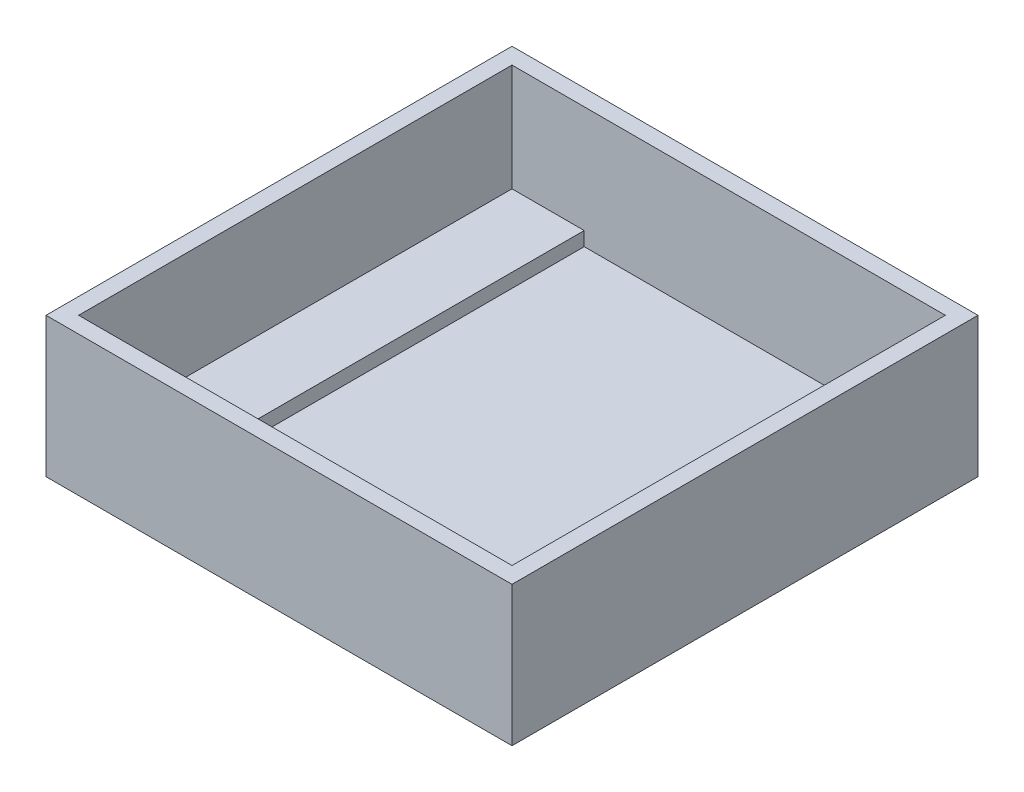
ISO-10303-21;
HEADER;
FILE_DESCRIPTION(('STEP AP214'),'2;1');
FILE_NAME('part.step','',(''),(''),'','','');
FILE_SCHEMA(('AUTOMOTIVE_DESIGN { 1 0 10303 214 1 1 1 1 }'));
ENDSEC;
DATA;
#1=APPLICATION_CONTEXT('core data for automotive mechanical design processes');
#2=APPLICATION_PROTOCOL_DEFINITION('international standard','automotive_design',2000,#1);
#3=PRODUCT_CONTEXT('',#1,'mechanical');
#4=PRODUCT('Part','Part','',(#3));
#5=PRODUCT_RELATED_PRODUCT_CATEGORY('part','',(#4));
#6=PRODUCT_DEFINITION_FORMATION('','',#4);
#7=PRODUCT_DEFINITION_CONTEXT('part definition',#1,'design');
#8=PRODUCT_DEFINITION('design','',#6,#7);
#9=PRODUCT_DEFINITION_SHAPE('','',#8);
#10=(LENGTH_UNIT() NAMED_UNIT(*) SI_UNIT(.MILLI.,.METRE.));
#11=(NAMED_UNIT(*) PLANE_ANGLE_UNIT() SI_UNIT($,.RADIAN.));
#12=(NAMED_UNIT(*) SI_UNIT($,.STERADIAN.) SOLID_ANGLE_UNIT());
#13=UNCERTAINTY_MEASURE_WITH_UNIT(LENGTH_MEASURE(1.E-05),#10,'distance_accuracy_value','');
#14=(GEOMETRIC_REPRESENTATION_CONTEXT(3) GLOBAL_UNCERTAINTY_ASSIGNED_CONTEXT((#13)) GLOBAL_UNIT_ASSIGNED_CONTEXT((#10,
#11,#12)) REPRESENTATION_CONTEXT('',''));
#15=CARTESIAN_POINT('',(0.,0.,0.));
#16=DIRECTION('',(0.,0.,1.));
#17=DIRECTION('',(1.,0.,0.));
#18=AXIS2_PLACEMENT_3D('',#15,#16,#17);
#19=CARTESIAN_POINT('',(1.33226762955019E-12,300.,-465.000000000001));
#20=DIRECTION('',(0.,0.,1.));
#21=DIRECTION('',(1.,0.,0.));
#22=AXIS2_PLACEMENT_3D('',#19,#20,#21);
#23=PLANE('',#22);
#24=DIRECTION('',(1.,0.,0.));
#25=VECTOR('',#24,1.);
#26=CARTESIAN_POINT('',(0.,40.,-465.));
#27=LINE('',#26,#25);
#28=CARTESIAN_POINT('',(-310.,40.,-465.));
#29=VERTEX_POINT('',#28);
#30=CARTESIAN_POINT('',(310.,40.,-465.));
#31=VERTEX_POINT('',#30);
#32=EDGE_CURVE('E147',#29,#31,#27,.T.);
#33=ORIENTED_EDGE('',*,*,#32,.T.);
#34=DIRECTION('',(0.,-1.,0.));
#35=VECTOR('',#34,1.);
#36=CARTESIAN_POINT('',(310.,70.,-465.));
#37=LINE('',#36,#35);
#38=CARTESIAN_POINT('',(310.,70.,-465.));
#39=VERTEX_POINT('',#38);
#40=EDGE_CURVE('E133',#39,#31,#37,.T.);
#41=ORIENTED_EDGE('',*,*,#40,.F.);
#42=DIRECTION('',(-1.,0.,0.));
#43=VECTOR('',#42,1.);
#44=CARTESIAN_POINT('',(1.33226762955019E-12,70.,-465.000000000001));
#45=LINE('',#44,#43);
#46=CARTESIAN_POINT('',(464.999999999999,70.,-465.));
#47=VERTEX_POINT('',#46);
#48=EDGE_CURVE('E164',#47,#39,#45,.T.);
#49=ORIENTED_EDGE('',*,*,#48,.F.);
#50=DIRECTION('',(0.,-1.,0.));
#51=VECTOR('',#50,1.);
#52=CARTESIAN_POINT('',(464.999999999999,300.,-465.));
#53=LINE('',#52,#51);
#54=CARTESIAN_POINT('',(464.999999999999,300.,-465.));
#55=VERTEX_POINT('',#54);
#56=EDGE_CURVE('E42',#55,#47,#53,.T.);
#57=ORIENTED_EDGE('',*,*,#56,.F.);
#58=DIRECTION('',(-1.,0.,0.));
#59=VECTOR('',#58,1.);
#60=CARTESIAN_POINT('',(1.33226762955019E-12,300.,-465.000000000001));
#61=LINE('',#60,#59);
#62=CARTESIAN_POINT('',(-465.,300.,-465.));
#63=VERTEX_POINT('',#62);
#64=EDGE_CURVE('E191',#55,#63,#61,.T.);
#65=ORIENTED_EDGE('',*,*,#64,.T.);
#66=DIRECTION('',(0.,-1.,0.));
#67=VECTOR('',#66,1.);
#68=CARTESIAN_POINT('',(-465.,300.,-465.));
#69=LINE('',#68,#67);
#70=CARTESIAN_POINT('',(-465.,70.,-465.));
#71=VERTEX_POINT('',#70);
#72=EDGE_CURVE('E223',#63,#71,#69,.T.);
#73=ORIENTED_EDGE('',*,*,#72,.T.);
#74=DIRECTION('',(-1.,0.,0.));
#75=VECTOR('',#74,1.);
#76=CARTESIAN_POINT('',(0.,70.,-465.));
#77=LINE('',#76,#75);
#78=CARTESIAN_POINT('',(-310.,70.,-465.));
#79=VERTEX_POINT('',#78);
#80=EDGE_CURVE('E182',#79,#71,#77,.T.);
#81=ORIENTED_EDGE('',*,*,#80,.F.);
#82=DIRECTION('',(0.,-1.,0.));
#83=VECTOR('',#82,1.);
#84=CARTESIAN_POINT('',(-310.,70.,-465.));
#85=LINE('',#84,#83);
#86=EDGE_CURVE('E149',#79,#29,#85,.T.);
#87=ORIENTED_EDGE('',*,*,#86,.T.);
#88=EDGE_LOOP('',(#33,#41,#49,#57,#65,#73,#81,#87));
#89=FACE_BOUND('',#88,.T.);
#90=ADVANCED_FACE('F39',(#89),#23,.T.);
#91=CARTESIAN_POINT('',(4.99600361081322E-13,300.,465.));
#92=DIRECTION('',(0.,0.,-1.));
#93=DIRECTION('',(-1.,0.,0.));
#94=AXIS2_PLACEMENT_3D('',#91,#92,#93);
#95=PLANE('',#94);
#96=DIRECTION('',(1.,0.,0.));
#97=VECTOR('',#96,1.);
#98=CARTESIAN_POINT('',(0.,40.,465.));
#99=LINE('',#98,#97);
#100=CARTESIAN_POINT('',(-310.,40.,465.));
#101=VERTEX_POINT('',#100);
#102=CARTESIAN_POINT('',(310.,40.,465.));
#103=VERTEX_POINT('',#102);
#104=EDGE_CURVE('E56',#101,#103,#99,.T.);
#105=ORIENTED_EDGE('',*,*,#104,.F.);
#106=DIRECTION('',(0.,-1.,0.));
#107=VECTOR('',#106,1.);
#108=CARTESIAN_POINT('',(-310.,70.,465.));
#109=LINE('',#108,#107);
#110=CARTESIAN_POINT('',(-310.,70.,465.));
#111=VERTEX_POINT('',#110);
#112=EDGE_CURVE('E187',#111,#101,#109,.T.);
#113=ORIENTED_EDGE('',*,*,#112,.F.);
#114=DIRECTION('',(1.,0.,0.));
#115=VECTOR('',#114,1.);
#116=CARTESIAN_POINT('',(1.66533453693773E-12,70.,464.999999999999));
#117=LINE('',#116,#115);
#118=CARTESIAN_POINT('',(-465.,70.,465.000000000001));
#119=VERTEX_POINT('',#118);
#120=EDGE_CURVE('E176',#119,#111,#117,.T.);
#121=ORIENTED_EDGE('',*,*,#120,.F.);
#122=DIRECTION('',(0.,-1.,0.));
#123=VECTOR('',#122,1.);
#124=CARTESIAN_POINT('',(-465.,300.,465.000000000001));
#125=LINE('',#124,#123);
#126=CARTESIAN_POINT('',(-465.,300.,465.000000000001));
#127=VERTEX_POINT('',#126);
#128=EDGE_CURVE('E249',#127,#119,#125,.T.);
#129=ORIENTED_EDGE('',*,*,#128,.F.);
#130=DIRECTION('',(1.,0.,0.));
#131=VECTOR('',#130,1.);
#132=CARTESIAN_POINT('',(4.99600361081322E-13,300.,465.));
#133=LINE('',#132,#131);
#134=CARTESIAN_POINT('',(465.,300.,465.));
#135=VERTEX_POINT('',#134);
#136=EDGE_CURVE('E200',#127,#135,#133,.T.);
#137=ORIENTED_EDGE('',*,*,#136,.T.);
#138=DIRECTION('',(0.,-1.,0.));
#139=VECTOR('',#138,1.);
#140=CARTESIAN_POINT('',(465.,300.,465.));
#141=LINE('',#140,#139);
#142=CARTESIAN_POINT('',(465.,70.,465.));
#143=VERTEX_POINT('',#142);
#144=EDGE_CURVE('E252',#135,#143,#141,.T.);
#145=ORIENTED_EDGE('',*,*,#144,.T.);
#146=DIRECTION('',(1.,0.,0.));
#147=VECTOR('',#146,1.);
#148=CARTESIAN_POINT('',(4.99600361081322E-13,70.,465.));
#149=LINE('',#148,#147);
#150=CARTESIAN_POINT('',(310.,70.,465.));
#151=VERTEX_POINT('',#150);
#152=EDGE_CURVE('E169',#151,#143,#149,.T.);
#153=ORIENTED_EDGE('',*,*,#152,.F.);
#154=DIRECTION('',(0.,-1.,0.));
#155=VECTOR('',#154,1.);
#156=CARTESIAN_POINT('',(310.,70.,465.));
#157=LINE('',#156,#155);
#158=EDGE_CURVE('E144',#151,#103,#157,.T.);
#159=ORIENTED_EDGE('',*,*,#158,.T.);
#160=EDGE_LOOP('',(#105,#113,#121,#129,#137,#145,#153,#159));
#161=FACE_BOUND('',#160,.T.);
#162=ADVANCED_FACE('F288',(#161),#95,.T.);
#163=CARTESIAN_POINT('',(0.,300.,500.));
#164=DIRECTION('',(0.,0.,-1.));
#165=DIRECTION('',(-1.,0.,0.));
#166=AXIS2_PLACEMENT_3D('',#163,#164,#165);
#167=PLANE('',#166);
#168=DIRECTION('',(1.,0.,0.));
#169=VECTOR('',#168,1.);
#170=CARTESIAN_POINT('',(0.,0.,500.));
#171=LINE('',#170,#169);
#172=CARTESIAN_POINT('',(-500.,0.,500.));
#173=VERTEX_POINT('',#172);
#174=CARTESIAN_POINT('',(500.,0.,500.));
#175=VERTEX_POINT('',#174);
#176=EDGE_CURVE('E190',#173,#175,#171,.T.);
#177=ORIENTED_EDGE('',*,*,#176,.T.);
#178=DIRECTION('',(0.,-1.,0.));
#179=VECTOR('',#178,1.);
#180=CARTESIAN_POINT('',(500.,300.,500.));
#181=LINE('',#180,#179);
#182=CARTESIAN_POINT('',(500.,300.,500.));
#183=VERTEX_POINT('',#182);
#184=EDGE_CURVE('E11',#183,#175,#181,.T.);
#185=ORIENTED_EDGE('',*,*,#184,.F.);
#186=DIRECTION('',(1.,0.,0.));
#187=VECTOR('',#186,1.);
#188=CARTESIAN_POINT('',(0.,300.,500.));
#189=LINE('',#188,#187);
#190=CARTESIAN_POINT('',(-500.,300.,500.));
#191=VERTEX_POINT('',#190);
#192=EDGE_CURVE('E208',#191,#183,#189,.T.);
#193=ORIENTED_EDGE('',*,*,#192,.F.);
#194=DIRECTION('',(0.,-1.,0.));
#195=VECTOR('',#194,1.);
#196=CARTESIAN_POINT('',(-500.,300.,500.));
#197=LINE('',#196,#195);
#198=EDGE_CURVE('E238',#191,#173,#197,.T.);
#199=ORIENTED_EDGE('',*,*,#198,.T.);
#200=EDGE_LOOP('',(#177,#185,#193,#199));
#201=FACE_BOUND('',#200,.T.);
#202=ADVANCED_FACE('F292',(#201),#167,.F.);
#203=CARTESIAN_POINT('',(500.,300.,0.));
#204=DIRECTION('',(-1.,0.,0.));
#205=DIRECTION('',(0.,0.,1.));
#206=AXIS2_PLACEMENT_3D('',#203,#204,#205);
#207=PLANE('',#206);
#208=DIRECTION('',(0.,0.,-1.));
#209=VECTOR('',#208,1.);
#210=CARTESIAN_POINT('',(500.,0.,0.));
#211=LINE('',#210,#209);
#212=CARTESIAN_POINT('',(500.,0.,-500.));
#213=VERTEX_POINT('',#212);
#214=EDGE_CURVE('E227',#175,#213,#211,.T.);
#215=ORIENTED_EDGE('',*,*,#214,.T.);
#216=DIRECTION('',(0.,-1.,0.));
#217=VECTOR('',#216,1.);
#218=CARTESIAN_POINT('',(500.,300.,-500.));
#219=LINE('',#218,#217);
#220=CARTESIAN_POINT('',(500.,300.,-500.));
#221=VERTEX_POINT('',#220);
#222=EDGE_CURVE('E48',#221,#213,#219,.T.);
#223=ORIENTED_EDGE('',*,*,#222,.F.);
#224=DIRECTION('',(0.,0.,-1.));
#225=VECTOR('',#224,1.);
#226=CARTESIAN_POINT('',(500.,300.,0.));
#227=LINE('',#226,#225);
#228=EDGE_CURVE('E212',#183,#221,#227,.T.);
#229=ORIENTED_EDGE('',*,*,#228,.F.);
#230=ORIENTED_EDGE('',*,*,#184,.T.);
#231=EDGE_LOOP('',(#215,#223,#229,#230));
#232=FACE_BOUND('',#231,.T.);
#233=ADVANCED_FACE('F297',(#232),#207,.F.);
#234=CARTESIAN_POINT('',(0.,300.,-500.));
#235=DIRECTION('',(0.,0.,-1.));
#236=DIRECTION('',(-1.,0.,0.));
#237=AXIS2_PLACEMENT_3D('',#234,#235,#236);
#238=PLANE('',#237);
#239=DIRECTION('',(1.,0.,0.));
#240=VECTOR('',#239,1.);
#241=CARTESIAN_POINT('',(0.,0.,-500.));
#242=LINE('',#241,#240);
#243=CARTESIAN_POINT('',(-500.,0.,-500.));
#244=VERTEX_POINT('',#243);
#245=EDGE_CURVE('E231',#244,#213,#242,.T.);
#246=ORIENTED_EDGE('',*,*,#245,.F.);
#247=DIRECTION('',(0.,-1.,0.));
#248=VECTOR('',#247,1.);
#249=CARTESIAN_POINT('',(-500.,300.,-500.));
#250=LINE('',#249,#248);
#251=CARTESIAN_POINT('',(-500.,300.,-500.));
#252=VERTEX_POINT('',#251);
#253=EDGE_CURVE('E241',#252,#244,#250,.T.);
#254=ORIENTED_EDGE('',*,*,#253,.F.);
#255=DIRECTION('',(1.,0.,0.));
#256=VECTOR('',#255,1.);
#257=CARTESIAN_POINT('',(0.,300.,-500.));
#258=LINE('',#257,#256);
#259=EDGE_CURVE('E215',#252,#221,#258,.T.);
#260=ORIENTED_EDGE('',*,*,#259,.T.);
#261=ORIENTED_EDGE('',*,*,#222,.T.);
#262=EDGE_LOOP('',(#246,#254,#260,#261));
#263=FACE_BOUND('',#262,.T.);
#264=ADVANCED_FACE('F302',(#263),#238,.T.);
#265=CARTESIAN_POINT('',(464.999999999999,300.,0.));
#266=DIRECTION('',(-1.,0.,0.));
#267=DIRECTION('',(0.,0.,1.));
#268=AXIS2_PLACEMENT_3D('',#265,#266,#267);
#269=PLANE('',#268);
#270=DIRECTION('',(0.,0.,-1.));
#271=VECTOR('',#270,1.);
#272=CARTESIAN_POINT('',(464.999999999999,70.,0.));
#273=LINE('',#272,#271);
#274=EDGE_CURVE('E161',#143,#47,#273,.T.);
#275=ORIENTED_EDGE('',*,*,#274,.F.);
#276=ORIENTED_EDGE('',*,*,#144,.F.);
#277=DIRECTION('',(0.,0.,-1.));
#278=VECTOR('',#277,1.);
#279=CARTESIAN_POINT('',(464.999999999999,300.,0.));
#280=LINE('',#279,#278);
#281=EDGE_CURVE('E195',#135,#55,#280,.T.);
#282=ORIENTED_EDGE('',*,*,#281,.T.);
#283=ORIENTED_EDGE('',*,*,#56,.T.);
#284=EDGE_LOOP('',(#275,#276,#282,#283));
#285=FACE_BOUND('',#284,.T.);
#286=ADVANCED_FACE('F260',(#285),#269,.T.);
#287=CARTESIAN_POINT('',(-465.,300.,0.));
#288=DIRECTION('',(1.,0.,0.));
#289=DIRECTION('',(0.,0.,-1.));
#290=AXIS2_PLACEMENT_3D('',#287,#288,#289);
#291=PLANE('',#290);
#292=DIRECTION('',(0.,0.,1.));
#293=VECTOR('',#292,1.);
#294=CARTESIAN_POINT('',(-465.,70.,0.));
#295=LINE('',#294,#293);
#296=EDGE_CURVE('E143',#71,#119,#295,.T.);
#297=ORIENTED_EDGE('',*,*,#296,.F.);
#298=ORIENTED_EDGE('',*,*,#72,.F.);
#299=DIRECTION('',(0.,0.,1.));
#300=VECTOR('',#299,1.);
#301=CARTESIAN_POINT('',(-465.,300.,0.));
#302=LINE('',#301,#300);
#303=EDGE_CURVE('E204',#63,#127,#302,.T.);
#304=ORIENTED_EDGE('',*,*,#303,.T.);
#305=ORIENTED_EDGE('',*,*,#128,.T.);
#306=EDGE_LOOP('',(#297,#298,#304,#305));
#307=FACE_BOUND('',#306,.T.);
#308=ADVANCED_FACE('F270',(#307),#291,.T.);
#309=CARTESIAN_POINT('',(-500.,300.,0.));
#310=DIRECTION('',(-1.,0.,0.));
#311=DIRECTION('',(0.,0.,1.));
#312=AXIS2_PLACEMENT_3D('',#309,#310,#311);
#313=PLANE('',#312);
#314=DIRECTION('',(0.,0.,-1.));
#315=VECTOR('',#314,1.);
#316=CARTESIAN_POINT('',(-500.,0.,0.));
#317=LINE('',#316,#315);
#318=EDGE_CURVE('E196',#173,#244,#317,.T.);
#319=ORIENTED_EDGE('',*,*,#318,.F.);
#320=ORIENTED_EDGE('',*,*,#198,.F.);
#321=DIRECTION('',(0.,0.,-1.));
#322=VECTOR('',#321,1.);
#323=CARTESIAN_POINT('',(-500.,300.,0.));
#324=LINE('',#323,#322);
#325=EDGE_CURVE('E219',#191,#252,#324,.T.);
#326=ORIENTED_EDGE('',*,*,#325,.T.);
#327=ORIENTED_EDGE('',*,*,#253,.T.);
#328=EDGE_LOOP('',(#319,#320,#326,#327));
#329=FACE_BOUND('',#328,.T.);
#330=ADVANCED_FACE('F307',(#329),#313,.T.);
#331=CARTESIAN_POINT('',(0.,300.,0.));
#332=DIRECTION('',(0.,1.,0.));
#333=DIRECTION('',(0.,0.,1.));
#334=AXIS2_PLACEMENT_3D('',#331,#332,#333);
#335=PLANE('',#334);
#336=ORIENTED_EDGE('',*,*,#64,.F.);
#337=ORIENTED_EDGE('',*,*,#281,.F.);
#338=ORIENTED_EDGE('',*,*,#136,.F.);
#339=ORIENTED_EDGE('',*,*,#303,.F.);
#340=EDGE_LOOP('',(#336,#337,#338,#339));
#341=FACE_BOUND('',#340,.T.);
#342=ORIENTED_EDGE('',*,*,#192,.T.);
#343=ORIENTED_EDGE('',*,*,#228,.T.);
#344=ORIENTED_EDGE('',*,*,#259,.F.);
#345=ORIENTED_EDGE('',*,*,#325,.F.);
#346=EDGE_LOOP('',(#342,#343,#344,#345));
#347=FACE_BOUND('',#346,.T.);
#348=ADVANCED_FACE('F265',(#341,#347),#335,.T.);
#349=CARTESIAN_POINT('',(0.,0.,0.));
#350=DIRECTION('',(0.,1.,0.));
#351=DIRECTION('',(0.,0.,1.));
#352=AXIS2_PLACEMENT_3D('',#349,#350,#351);
#353=PLANE('',#352);
#354=ORIENTED_EDGE('',*,*,#176,.F.);
#355=ORIENTED_EDGE('',*,*,#318,.T.);
#356=ORIENTED_EDGE('',*,*,#245,.T.);
#357=ORIENTED_EDGE('',*,*,#214,.F.);
#358=EDGE_LOOP('',(#354,#355,#356,#357));
#359=FACE_BOUND('',#358,.T.);
#360=ADVANCED_FACE('F277',(#359),#353,.F.);
#361=CARTESIAN_POINT('',(-310.,70.,0.));
#362=DIRECTION('',(-1.,0.,0.));
#363=DIRECTION('',(0.,0.,1.));
#364=AXIS2_PLACEMENT_3D('',#361,#362,#363);
#365=PLANE('',#364);
#366=ORIENTED_EDGE('',*,*,#112,.T.);
#367=DIRECTION('',(0.,0.,-1.));
#368=VECTOR('',#367,1.);
#369=CARTESIAN_POINT('',(-310.,40.,0.));
#370=LINE('',#369,#368);
#371=EDGE_CURVE('E63',#101,#29,#370,.T.);
#372=ORIENTED_EDGE('',*,*,#371,.T.);
#373=ORIENTED_EDGE('',*,*,#86,.F.);
#374=DIRECTION('',(0.,0.,-1.));
#375=VECTOR('',#374,1.);
#376=CARTESIAN_POINT('',(-310.,70.,0.));
#377=LINE('',#376,#375);
#378=EDGE_CURVE('E179',#111,#79,#377,.T.);
#379=ORIENTED_EDGE('',*,*,#378,.F.);
#380=EDGE_LOOP('',(#366,#372,#373,#379));
#381=FACE_BOUND('',#380,.T.);
#382=ADVANCED_FACE('F275',(#381),#365,.F.);
#383=CARTESIAN_POINT('',(0.,70.,0.));
#384=DIRECTION('',(0.,1.,0.));
#385=DIRECTION('',(0.,0.,1.));
#386=AXIS2_PLACEMENT_3D('',#383,#384,#385);
#387=PLANE('',#386);
#388=ORIENTED_EDGE('',*,*,#296,.T.);
#389=ORIENTED_EDGE('',*,*,#120,.T.);
#390=ORIENTED_EDGE('',*,*,#378,.T.);
#391=ORIENTED_EDGE('',*,*,#80,.T.);
#392=EDGE_LOOP('',(#388,#389,#390,#391));
#393=FACE_BOUND('',#392,.T.);
#394=ADVANCED_FACE('F272',(#393),#387,.T.);
#395=CARTESIAN_POINT('',(310.,70.,0.));
#396=DIRECTION('',(-1.,0.,0.));
#397=DIRECTION('',(0.,0.,1.));
#398=AXIS2_PLACEMENT_3D('',#395,#396,#397);
#399=PLANE('',#398);
#400=DIRECTION('',(0.,0.,-1.));
#401=VECTOR('',#400,1.);
#402=CARTESIAN_POINT('',(310.,40.,0.));
#403=LINE('',#402,#401);
#404=EDGE_CURVE('E137',#103,#31,#403,.T.);
#405=ORIENTED_EDGE('',*,*,#404,.F.);
#406=ORIENTED_EDGE('',*,*,#158,.F.);
#407=DIRECTION('',(0.,0.,-1.));
#408=VECTOR('',#407,1.);
#409=CARTESIAN_POINT('',(310.,70.,0.));
#410=LINE('',#409,#408);
#411=EDGE_CURVE('E139',#151,#39,#410,.T.);
#412=ORIENTED_EDGE('',*,*,#411,.T.);
#413=ORIENTED_EDGE('',*,*,#40,.T.);
#414=EDGE_LOOP('',(#405,#406,#412,#413));
#415=FACE_BOUND('',#414,.T.);
#416=ADVANCED_FACE('F135',(#415),#399,.T.);
#417=CARTESIAN_POINT('',(0.,70.,0.));
#418=DIRECTION('',(0.,1.,0.));
#419=DIRECTION('',(0.,0.,1.));
#420=AXIS2_PLACEMENT_3D('',#417,#418,#419);
#421=PLANE('',#420);
#422=ORIENTED_EDGE('',*,*,#274,.T.);
#423=ORIENTED_EDGE('',*,*,#48,.T.);
#424=ORIENTED_EDGE('',*,*,#411,.F.);
#425=ORIENTED_EDGE('',*,*,#152,.T.);
#426=EDGE_LOOP('',(#422,#423,#424,#425));
#427=FACE_BOUND('',#426,.T.);
#428=ADVANCED_FACE('F347',(#427),#421,.T.);
#429=CARTESIAN_POINT('',(0.,40.,0.));
#430=DIRECTION('',(0.,1.,0.));
#431=DIRECTION('',(0.,0.,1.));
#432=AXIS2_PLACEMENT_3D('',#429,#430,#431);
#433=PLANE('',#432);
#434=ORIENTED_EDGE('',*,*,#104,.T.);
#435=ORIENTED_EDGE('',*,*,#404,.T.);
#436=ORIENTED_EDGE('',*,*,#32,.F.);
#437=ORIENTED_EDGE('',*,*,#371,.F.);
#438=EDGE_LOOP('',(#434,#435,#436,#437));
#439=FACE_BOUND('',#438,.T.);
#440=ADVANCED_FACE('F153',(#439),#433,.T.);
#441=CLOSED_SHELL('',(#90,#162,#202,#233,#264,#286,#308,#330,#348,#360,#382,#394,#416,#428,#440));
#442=MANIFOLD_SOLID_BREP('B2',#441);
#443=ADVANCED_BREP_SHAPE_REPRESENTATION('',(#18,#442),#14);
#444=SHAPE_DEFINITION_REPRESENTATION(#9,#443);
ENDSEC;
END-ISO-10303-21;
